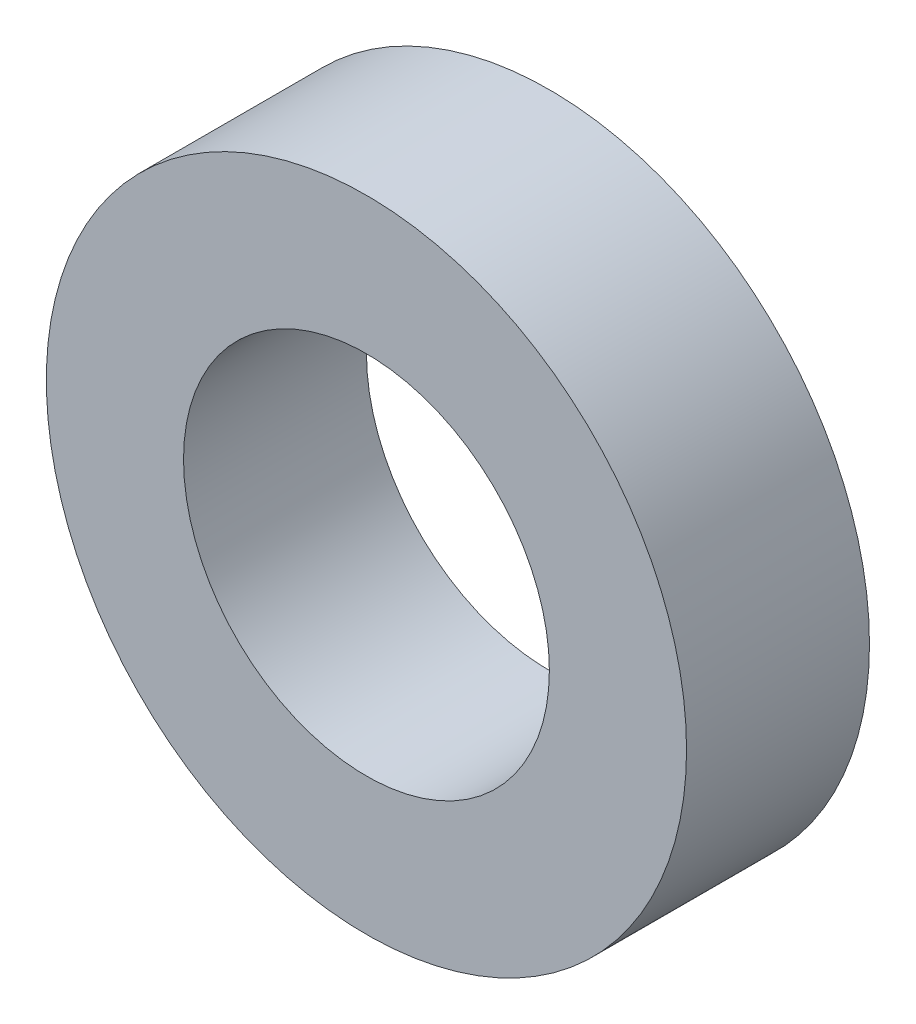
ISO-10303-21;
HEADER;
FILE_DESCRIPTION(('STEP AP214'),'2;1');
FILE_NAME('part.step','',(''),(''),'','','');
FILE_SCHEMA(('AUTOMOTIVE_DESIGN { 1 0 10303 214 1 1 1 1 }'));
ENDSEC;
DATA;
#1=APPLICATION_CONTEXT('core data for automotive mechanical design processes');
#2=APPLICATION_PROTOCOL_DEFINITION('international standard','automotive_design',2000,#1);
#3=PRODUCT_CONTEXT('',#1,'mechanical');
#4=PRODUCT('Part','Part','',(#3));
#5=PRODUCT_RELATED_PRODUCT_CATEGORY('part','',(#4));
#6=PRODUCT_DEFINITION_FORMATION('','',#4);
#7=PRODUCT_DEFINITION_CONTEXT('part definition',#1,'design');
#8=PRODUCT_DEFINITION('design','',#6,#7);
#9=PRODUCT_DEFINITION_SHAPE('','',#8);
#10=(LENGTH_UNIT() NAMED_UNIT(*) SI_UNIT(.MILLI.,.METRE.));
#11=(NAMED_UNIT(*) PLANE_ANGLE_UNIT() SI_UNIT($,.RADIAN.));
#12=(NAMED_UNIT(*) SI_UNIT($,.STERADIAN.) SOLID_ANGLE_UNIT());
#13=UNCERTAINTY_MEASURE_WITH_UNIT(LENGTH_MEASURE(1.E-05),#10,'distance_accuracy_value','');
#14=(GEOMETRIC_REPRESENTATION_CONTEXT(3) GLOBAL_UNCERTAINTY_ASSIGNED_CONTEXT((#13)) GLOBAL_UNIT_ASSIGNED_CONTEXT((#10,
#11,#12)) REPRESENTATION_CONTEXT('',''));
#15=CARTESIAN_POINT('',(0.,0.,0.));
#16=DIRECTION('',(0.,0.,1.));
#17=DIRECTION('',(1.,0.,0.));
#18=AXIS2_PLACEMENT_3D('',#15,#16,#17);
#19=CARTESIAN_POINT('',(0.,0.,10.));
#20=DIRECTION('',(0.,0.,1.));
#21=DIRECTION('',(1.,0.,0.));
#22=AXIS2_PLACEMENT_3D('',#19,#20,#21);
#23=PLANE('',#22);
#24=CARTESIAN_POINT('',(0.,0.,10.));
#25=DIRECTION('',(0.,0.,1.));
#26=DIRECTION('',(1.,0.,0.));
#27=AXIS2_PLACEMENT_3D('',#24,#25,#26);
#28=CIRCLE('',#27,17.5);
#29=CARTESIAN_POINT('',(17.5,0.,10.));
#30=VERTEX_POINT('',#29);
#31=EDGE_CURVE('E10',#30,#30,#28,.T.);
#32=ORIENTED_EDGE('',*,*,#31,.T.);
#33=EDGE_LOOP('',(#32));
#34=FACE_BOUND('',#33,.T.);
#35=CARTESIAN_POINT('',(0.,0.,10.));
#36=DIRECTION('',(0.,0.,1.));
#37=DIRECTION('',(1.,0.,0.));
#38=AXIS2_PLACEMENT_3D('',#35,#36,#37);
#39=CIRCLE('',#38,10.);
#40=CARTESIAN_POINT('',(10.,0.,10.));
#41=VERTEX_POINT('',#40);
#42=EDGE_CURVE('E50',#41,#41,#39,.T.);
#43=ORIENTED_EDGE('',*,*,#42,.F.);
#44=EDGE_LOOP('',(#43));
#45=FACE_BOUND('',#44,.T.);
#46=ADVANCED_FACE('F37',(#34,#45),#23,.T.);
#47=CARTESIAN_POINT('',(0.,0.,0.));
#48=DIRECTION('',(0.,0.,1.));
#49=DIRECTION('',(1.,0.,0.));
#50=AXIS2_PLACEMENT_3D('',#47,#48,#49);
#51=PLANE('',#50);
#52=CARTESIAN_POINT('',(0.,0.,0.));
#53=DIRECTION('',(0.,0.,1.));
#54=DIRECTION('',(1.,0.,0.));
#55=AXIS2_PLACEMENT_3D('',#52,#53,#54);
#56=CIRCLE('',#55,17.5);
#57=CARTESIAN_POINT('',(17.5,0.,0.));
#58=VERTEX_POINT('',#57);
#59=EDGE_CURVE('E41',#58,#58,#56,.T.);
#60=ORIENTED_EDGE('',*,*,#59,.F.);
#61=EDGE_LOOP('',(#60));
#62=FACE_BOUND('',#61,.T.);
#63=CARTESIAN_POINT('',(0.,0.,0.));
#64=DIRECTION('',(0.,0.,1.));
#65=DIRECTION('',(1.,0.,0.));
#66=AXIS2_PLACEMENT_3D('',#63,#64,#65);
#67=CIRCLE('',#66,10.);
#68=CARTESIAN_POINT('',(10.,0.,0.));
#69=VERTEX_POINT('',#68);
#70=EDGE_CURVE('E52',#69,#69,#67,.T.);
#71=ORIENTED_EDGE('',*,*,#70,.T.);
#72=EDGE_LOOP('',(#71));
#73=FACE_BOUND('',#72,.T.);
#74=ADVANCED_FACE('F64',(#62,#73),#51,.F.);
#75=CARTESIAN_POINT('',(0.,0.,10.));
#76=DIRECTION('',(0.,0.,-1.));
#77=DIRECTION('',(-1.,0.,0.));
#78=AXIS2_PLACEMENT_3D('',#75,#76,#77);
#79=CYLINDRICAL_SURFACE('',#78,17.5);
#80=ORIENTED_EDGE('',*,*,#31,.F.);
#81=EDGE_LOOP('',(#80));
#82=FACE_BOUND('',#81,.T.);
#83=ORIENTED_EDGE('',*,*,#59,.T.);
#84=EDGE_LOOP('',(#83));
#85=FACE_BOUND('',#84,.T.);
#86=ADVANCED_FACE('F39',(#82,#85),#79,.T.);
#87=CARTESIAN_POINT('',(0.,0.,10.));
#88=DIRECTION('',(0.,0.,-1.));
#89=DIRECTION('',(-1.,0.,0.));
#90=AXIS2_PLACEMENT_3D('',#87,#88,#89);
#91=CYLINDRICAL_SURFACE('',#90,10.);
#92=ORIENTED_EDGE('',*,*,#42,.T.);
#93=EDGE_LOOP('',(#92));
#94=FACE_BOUND('',#93,.T.);
#95=ORIENTED_EDGE('',*,*,#70,.F.);
#96=EDGE_LOOP('',(#95));
#97=FACE_BOUND('',#96,.T.);
#98=ADVANCED_FACE('F60',(#94,#97),#91,.F.);
#99=CLOSED_SHELL('',(#46,#74,#86,#98));
#100=MANIFOLD_SOLID_BREP('B2',#99);
#101=ADVANCED_BREP_SHAPE_REPRESENTATION('',(#18,#100),#14);
#102=SHAPE_DEFINITION_REPRESENTATION(#9,#101);
ENDSEC;
END-ISO-10303-21;
